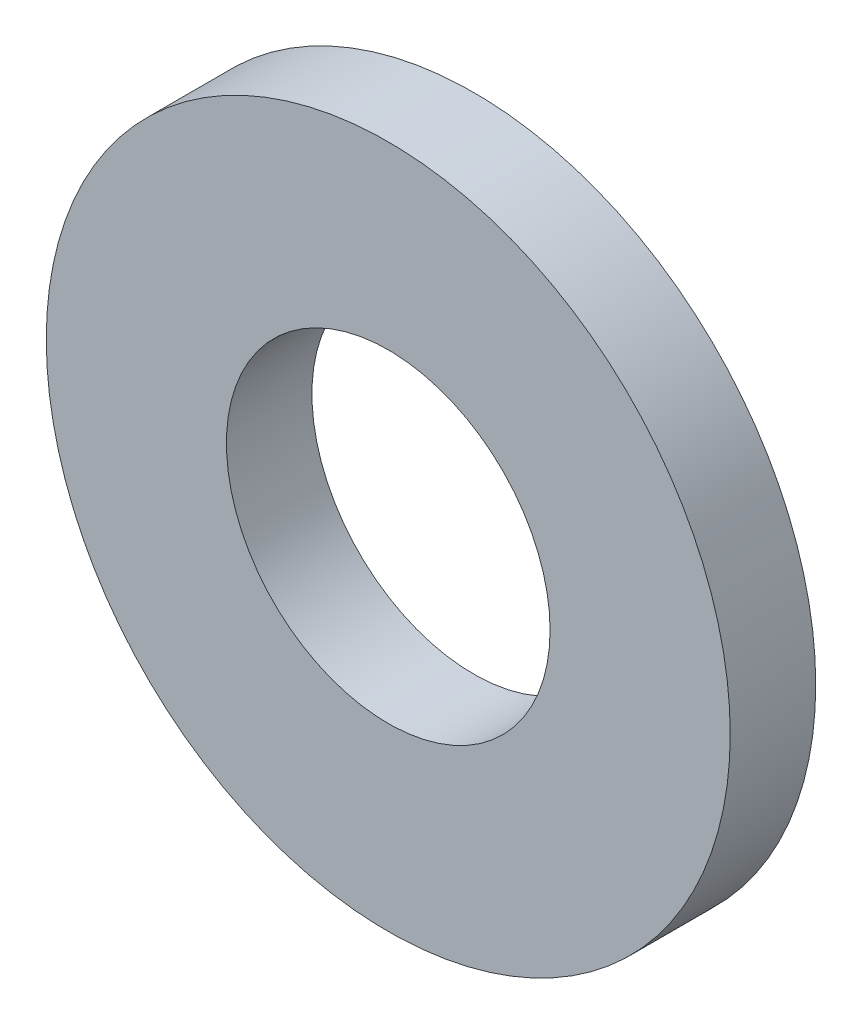
ISO-10303-21;
HEADER;
FILE_DESCRIPTION(('STEP AP214'),'2;1');
FILE_NAME('part.step','',(''),(''),'','','');
FILE_SCHEMA(('AUTOMOTIVE_DESIGN { 1 0 10303 214 1 1 1 1 }'));
ENDSEC;
DATA;
#1=APPLICATION_CONTEXT('core data for automotive mechanical design processes');
#2=APPLICATION_PROTOCOL_DEFINITION('international standard','automotive_design',2000,#1);
#3=PRODUCT_CONTEXT('',#1,'mechanical');
#4=PRODUCT('Part','Part','',(#3));
#5=PRODUCT_RELATED_PRODUCT_CATEGORY('part','',(#4));
#6=PRODUCT_DEFINITION_FORMATION('','',#4);
#7=PRODUCT_DEFINITION_CONTEXT('part definition',#1,'design');
#8=PRODUCT_DEFINITION('design','',#6,#7);
#9=PRODUCT_DEFINITION_SHAPE('','',#8);
#10=(LENGTH_UNIT() NAMED_UNIT(*) SI_UNIT(.MILLI.,.METRE.));
#11=(NAMED_UNIT(*) PLANE_ANGLE_UNIT() SI_UNIT($,.RADIAN.));
#12=(NAMED_UNIT(*) SI_UNIT($,.STERADIAN.) SOLID_ANGLE_UNIT());
#13=UNCERTAINTY_MEASURE_WITH_UNIT(LENGTH_MEASURE(1.E-05),#10,'distance_accuracy_value','');
#14=(GEOMETRIC_REPRESENTATION_CONTEXT(3) GLOBAL_UNCERTAINTY_ASSIGNED_CONTEXT((#13)) GLOBAL_UNIT_ASSIGNED_CONTEXT((#10,
#11,#12)) REPRESENTATION_CONTEXT('',''));
#15=CARTESIAN_POINT('',(0.,0.,0.));
#16=DIRECTION('',(0.,0.,1.));
#17=DIRECTION('',(1.,0.,0.));
#18=AXIS2_PLACEMENT_3D('',#15,#16,#17);
#19=CARTESIAN_POINT('',(0.,0.,0.7));
#20=DIRECTION('',(0.,0.,1.));
#21=DIRECTION('',(1.,0.,0.));
#22=AXIS2_PLACEMENT_3D('',#19,#20,#21);
#23=PLANE('',#22);
#24=CARTESIAN_POINT('',(0.,0.,0.7));
#25=DIRECTION('',(0.,0.,1.));
#26=DIRECTION('',(1.,0.,0.));
#27=AXIS2_PLACEMENT_3D('',#24,#25,#26);
#28=CIRCLE('',#27,2.8);
#29=CARTESIAN_POINT('',(2.8,0.,0.7));
#30=VERTEX_POINT('',#29);
#31=EDGE_CURVE('E10',#30,#30,#28,.T.);
#32=ORIENTED_EDGE('',*,*,#31,.T.);
#33=EDGE_LOOP('',(#32));
#34=FACE_BOUND('',#33,.T.);
#35=CARTESIAN_POINT('',(0.,0.,0.7));
#36=DIRECTION('',(0.,0.,1.));
#37=DIRECTION('',(1.,0.,0.));
#38=AXIS2_PLACEMENT_3D('',#35,#36,#37);
#39=CIRCLE('',#38,1.325);
#40=CARTESIAN_POINT('',(1.325,0.,0.7));
#41=VERTEX_POINT('',#40);
#42=EDGE_CURVE('E41',#41,#41,#39,.T.);
#43=ORIENTED_EDGE('',*,*,#42,.F.);
#44=EDGE_LOOP('',(#43));
#45=FACE_BOUND('',#44,.T.);
#46=ADVANCED_FACE('F30',(#34,#45),#23,.T.);
#47=CARTESIAN_POINT('',(0.,0.,0.));
#48=DIRECTION('',(0.,0.,1.));
#49=DIRECTION('',(1.,0.,0.));
#50=AXIS2_PLACEMENT_3D('',#47,#48,#49);
#51=PLANE('',#50);
#52=CARTESIAN_POINT('',(0.,0.,0.));
#53=DIRECTION('',(0.,0.,1.));
#54=DIRECTION('',(1.,0.,0.));
#55=AXIS2_PLACEMENT_3D('',#52,#53,#54);
#56=CIRCLE('',#55,2.8);
#57=CARTESIAN_POINT('',(2.8,0.,0.));
#58=VERTEX_POINT('',#57);
#59=EDGE_CURVE('E34',#58,#58,#56,.T.);
#60=ORIENTED_EDGE('',*,*,#59,.F.);
#61=EDGE_LOOP('',(#60));
#62=FACE_BOUND('',#61,.T.);
#63=CARTESIAN_POINT('',(0.,0.,0.));
#64=DIRECTION('',(0.,0.,1.));
#65=DIRECTION('',(1.,0.,0.));
#66=AXIS2_PLACEMENT_3D('',#63,#64,#65);
#67=CIRCLE('',#66,1.325);
#68=CARTESIAN_POINT('',(1.325,0.,0.));
#69=VERTEX_POINT('',#68);
#70=EDGE_CURVE('E43',#69,#69,#67,.T.);
#71=ORIENTED_EDGE('',*,*,#70,.T.);
#72=EDGE_LOOP('',(#71));
#73=FACE_BOUND('',#72,.T.);
#74=ADVANCED_FACE('F53',(#62,#73),#51,.F.);
#75=CARTESIAN_POINT('',(0.,0.,0.7));
#76=DIRECTION('',(0.,0.,-1.));
#77=DIRECTION('',(-1.,0.,0.));
#78=AXIS2_PLACEMENT_3D('',#75,#76,#77);
#79=CYLINDRICAL_SURFACE('',#78,2.8);
#80=ORIENTED_EDGE('',*,*,#31,.F.);
#81=EDGE_LOOP('',(#80));
#82=FACE_BOUND('',#81,.T.);
#83=ORIENTED_EDGE('',*,*,#59,.T.);
#84=EDGE_LOOP('',(#83));
#85=FACE_BOUND('',#84,.T.);
#86=ADVANCED_FACE('F32',(#82,#85),#79,.T.);
#87=CARTESIAN_POINT('',(0.,0.,0.7));
#88=DIRECTION('',(0.,0.,-1.));
#89=DIRECTION('',(-1.,0.,0.));
#90=AXIS2_PLACEMENT_3D('',#87,#88,#89);
#91=CYLINDRICAL_SURFACE('',#90,1.325);
#92=ORIENTED_EDGE('',*,*,#42,.T.);
#93=EDGE_LOOP('',(#92));
#94=FACE_BOUND('',#93,.T.);
#95=ORIENTED_EDGE('',*,*,#70,.F.);
#96=EDGE_LOOP('',(#95));
#97=FACE_BOUND('',#96,.T.);
#98=ADVANCED_FACE('F49',(#94,#97),#91,.F.);
#99=CLOSED_SHELL('',(#46,#74,#86,#98));
#100=MANIFOLD_SOLID_BREP('B2',#99);
#101=ADVANCED_BREP_SHAPE_REPRESENTATION('',(#18,#100),#14);
#102=SHAPE_DEFINITION_REPRESENTATION(#9,#101);
ENDSEC;
END-ISO-10303-21;
